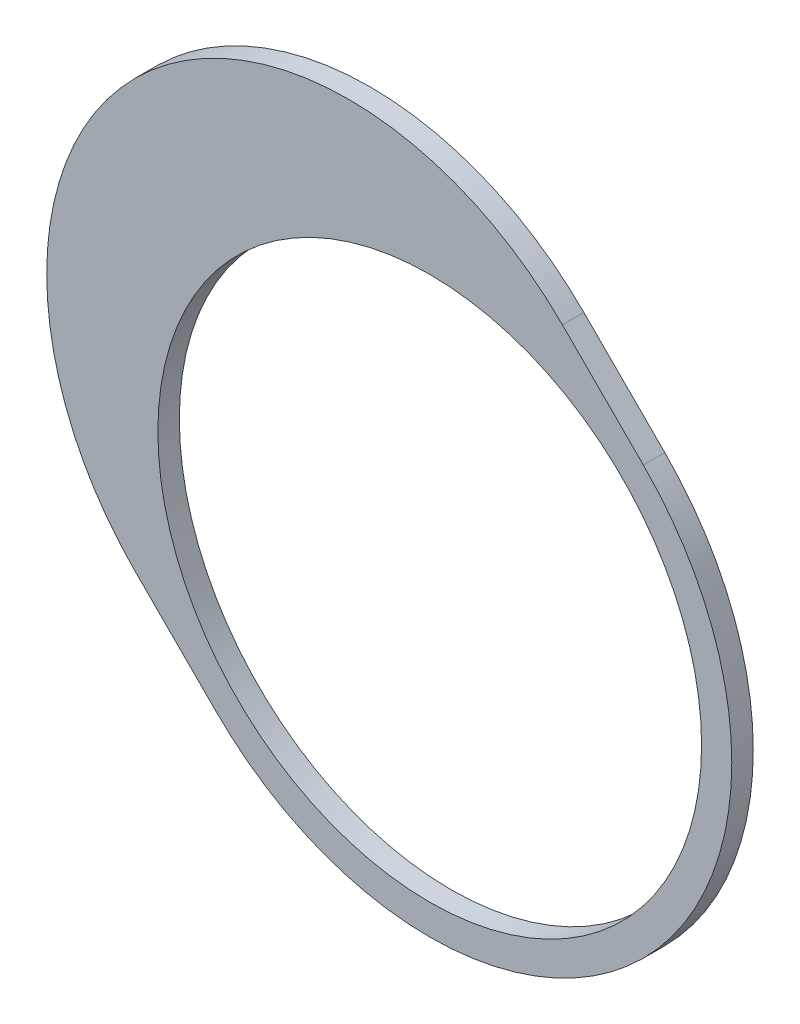
ISO-10303-21;
HEADER;
FILE_DESCRIPTION(('STEP AP214'),'2;1');
FILE_NAME('part.step','',(''),(''),'','','');
FILE_SCHEMA(('AUTOMOTIVE_DESIGN { 1 0 10303 214 1 1 1 1 }'));
ENDSEC;
DATA;
#1=APPLICATION_CONTEXT('core data for automotive mechanical design processes');
#2=APPLICATION_PROTOCOL_DEFINITION('international standard','automotive_design',2000,#1);
#3=PRODUCT_CONTEXT('',#1,'mechanical');
#4=PRODUCT('Part','Part','',(#3));
#5=PRODUCT_RELATED_PRODUCT_CATEGORY('part','',(#4));
#6=PRODUCT_DEFINITION_FORMATION('','',#4);
#7=PRODUCT_DEFINITION_CONTEXT('part definition',#1,'design');
#8=PRODUCT_DEFINITION('design','',#6,#7);
#9=PRODUCT_DEFINITION_SHAPE('','',#8);
#10=(LENGTH_UNIT() NAMED_UNIT(*) SI_UNIT(.MILLI.,.METRE.));
#11=(NAMED_UNIT(*) PLANE_ANGLE_UNIT() SI_UNIT($,.RADIAN.));
#12=(NAMED_UNIT(*) SI_UNIT($,.STERADIAN.) SOLID_ANGLE_UNIT());
#13=UNCERTAINTY_MEASURE_WITH_UNIT(LENGTH_MEASURE(1.E-05),#10,'distance_accuracy_value','');
#14=(GEOMETRIC_REPRESENTATION_CONTEXT(3) GLOBAL_UNCERTAINTY_ASSIGNED_CONTEXT((#13)) GLOBAL_UNIT_ASSIGNED_CONTEXT((#10,
#11,#12)) REPRESENTATION_CONTEXT('',''));
#15=CARTESIAN_POINT('',(0.,0.,0.));
#16=DIRECTION('',(0.,0.,1.));
#17=DIRECTION('',(1.,0.,0.));
#18=AXIS2_PLACEMENT_3D('',#15,#16,#17);
#19=CARTESIAN_POINT('',(45.51252264,68.18039958,0.));
#20=DIRECTION('',(0.70710678118651,0.707106781186585,0.));
#21=DIRECTION('',(0.707106781186585,-0.70710678118651,0.));
#22=AXIS2_PLACEMENT_3D('',#19,#20,#21);
#23=PLANE('',#22);
#24=DIRECTION('',(0.707106781186585,-0.70710678118651,0.));
#25=VECTOR('',#24,1.);
#26=CARTESIAN_POINT('',(45.51252264,68.18039958,0.03556));
#27=LINE('',#26,#25);
#28=CARTESIAN_POINT('',(45.51252264,68.18039958,0.03556));
#29=VERTEX_POINT('',#28);
#30=CARTESIAN_POINT('',(45.64645684,68.04646538,0.03556));
#31=VERTEX_POINT('',#30);
#32=EDGE_CURVE('E11',#29,#31,#27,.T.);
#33=ORIENTED_EDGE('',*,*,#32,.F.);
#34=DIRECTION('',(0.,0.,1.));
#35=VECTOR('',#34,1.);
#36=CARTESIAN_POINT('',(45.51252264,68.18039958,0.));
#37=LINE('',#36,#35);
#38=CARTESIAN_POINT('',(45.51252264,68.18039958,0.));
#39=VERTEX_POINT('',#38);
#40=EDGE_CURVE('E24',#39,#29,#37,.T.);
#41=ORIENTED_EDGE('',*,*,#40,.F.);
#42=DIRECTION('',(0.707106781186585,-0.70710678118651,0.));
#43=VECTOR('',#42,1.);
#44=CARTESIAN_POINT('',(45.51252264,68.18039958,0.));
#45=LINE('',#44,#43);
#46=CARTESIAN_POINT('',(45.64645684,68.04646538,0.));
#47=VERTEX_POINT('',#46);
#48=EDGE_CURVE('E96',#39,#47,#45,.T.);
#49=ORIENTED_EDGE('',*,*,#48,.T.);
#50=DIRECTION('',(0.,0.,1.));
#51=VECTOR('',#50,1.);
#52=CARTESIAN_POINT('',(45.64645684,68.04646538,0.));
#53=LINE('',#52,#51);
#54=EDGE_CURVE('E37',#47,#31,#53,.T.);
#55=ORIENTED_EDGE('',*,*,#54,.T.);
#56=EDGE_LOOP('',(#33,#41,#49,#55));
#57=FACE_BOUND('',#56,.T.);
#58=ADVANCED_FACE('F17',(#57),#23,.F.);
#59=CARTESIAN_POINT('',(45.86607413,68.53395234,0.));
#60=DIRECTION('',(0.,0.,-1.));
#61=DIRECTION('',(0.707105511180848,0.707108051189966,0.));
#62=AXIS2_PLACEMENT_3D('',#59,#60,#61);
#63=CYLINDRICAL_SURFACE('',#62,0.499998210181641);
#64=CARTESIAN_POINT('',(45.86607413,68.53395234,0.03556));
#65=DIRECTION('',(0.,0.,1.));
#66=DIRECTION('',(0.707105511180848,0.707108051189966,0.));
#67=AXIS2_PLACEMENT_3D('',#64,#65,#66);
#68=CIRCLE('',#67,0.499998210181641);
#69=CARTESIAN_POINT('',(46.21962562,68.8875051,0.03556));
#70=VERTEX_POINT('',#69);
#71=EDGE_CURVE('E92',#70,#29,#68,.T.);
#72=ORIENTED_EDGE('',*,*,#71,.F.);
#73=DIRECTION('',(0.,0.,1.));
#74=VECTOR('',#73,1.);
#75=CARTESIAN_POINT('',(46.21962562,68.8875051,0.));
#76=LINE('',#75,#74);
#77=CARTESIAN_POINT('',(46.21962562,68.8875051,0.));
#78=VERTEX_POINT('',#77);
#79=EDGE_CURVE('E90',#78,#70,#76,.T.);
#80=ORIENTED_EDGE('',*,*,#79,.F.);
#81=CARTESIAN_POINT('',(45.86607413,68.53395234,0.));
#82=DIRECTION('',(0.,0.,1.));
#83=DIRECTION('',(0.707105511180848,0.707108051189966,0.));
#84=AXIS2_PLACEMENT_3D('',#81,#82,#83);
#85=CIRCLE('',#84,0.499998210181641);
#86=EDGE_CURVE('E88',#78,#39,#85,.T.);
#87=ORIENTED_EDGE('',*,*,#86,.T.);
#88=ORIENTED_EDGE('',*,*,#40,.T.);
#89=EDGE_LOOP('',(#72,#80,#87,#88));
#90=FACE_BOUND('',#89,.T.);
#91=ADVANCED_FACE('F111',(#90),#63,.T.);
#92=CARTESIAN_POINT('',(46.0000096,68.40001687,0.));
#93=DIRECTION('',(0.,0.,-1.));
#94=DIRECTION('',(-0.707108051189952,-0.707105511180862,0.));
#95=AXIS2_PLACEMENT_3D('',#92,#93,#94);
#96=CYLINDRICAL_SURFACE('',#95,0.499998210181635);
#97=CARTESIAN_POINT('',(46.0000096,68.40001687,0.03556));
#98=DIRECTION('',(0.,0.,1.));
#99=DIRECTION('',(-0.707108051189952,-0.707105511180862,0.));
#100=AXIS2_PLACEMENT_3D('',#97,#98,#99);
#101=CIRCLE('',#100,0.499998210181635);
#102=CARTESIAN_POINT('',(46.35356236,68.75356836,0.03556));
#103=VERTEX_POINT('',#102);
#104=EDGE_CURVE('E85',#31,#103,#101,.T.);
#105=ORIENTED_EDGE('',*,*,#104,.F.);
#106=ORIENTED_EDGE('',*,*,#54,.F.);
#107=CARTESIAN_POINT('',(46.0000096,68.40001687,0.));
#108=DIRECTION('',(0.,0.,1.));
#109=DIRECTION('',(-0.707108051189952,-0.707105511180862,0.));
#110=AXIS2_PLACEMENT_3D('',#107,#108,#109);
#111=CIRCLE('',#110,0.499998210181635);
#112=CARTESIAN_POINT('',(46.35356236,68.75356836,0.));
#113=VERTEX_POINT('',#112);
#114=EDGE_CURVE('E82',#47,#113,#111,.T.);
#115=ORIENTED_EDGE('',*,*,#114,.T.);
#116=DIRECTION('',(0.,0.,1.));
#117=VECTOR('',#116,1.);
#118=CARTESIAN_POINT('',(46.35356236,68.75356836,0.));
#119=LINE('',#118,#117);
#120=EDGE_CURVE('E80',#113,#103,#119,.T.);
#121=ORIENTED_EDGE('',*,*,#120,.T.);
#122=EDGE_LOOP('',(#105,#106,#115,#121));
#123=FACE_BOUND('',#122,.T.);
#124=ADVANCED_FACE('F104',(#123),#96,.T.);
#125=CARTESIAN_POINT('',(46.35356236,68.75356836,0.));
#126=DIRECTION('',(-0.707106781186548,-0.707106781186548,0.));
#127=DIRECTION('',(-0.707106781186548,0.707106781186548,0.));
#128=AXIS2_PLACEMENT_3D('',#125,#126,#127);
#129=PLANE('',#128);
#130=DIRECTION('',(-0.707106781186548,0.707106781186548,0.));
#131=VECTOR('',#130,1.);
#132=CARTESIAN_POINT('',(46.35356236,68.75356836,0.03556));
#133=LINE('',#132,#131);
#134=EDGE_CURVE('E77',#103,#70,#133,.T.);
#135=ORIENTED_EDGE('',*,*,#134,.F.);
#136=ORIENTED_EDGE('',*,*,#120,.F.);
#137=DIRECTION('',(-0.707106781186548,0.707106781186548,0.));
#138=VECTOR('',#137,1.);
#139=CARTESIAN_POINT('',(46.35356236,68.75356836,0.));
#140=LINE('',#139,#138);
#141=EDGE_CURVE('E68',#113,#78,#140,.T.);
#142=ORIENTED_EDGE('',*,*,#141,.T.);
#143=ORIENTED_EDGE('',*,*,#79,.T.);
#144=EDGE_LOOP('',(#135,#136,#142,#143));
#145=FACE_BOUND('',#144,.T.);
#146=ADVANCED_FACE('F110',(#145),#129,.F.);
#147=CARTESIAN_POINT('',(46.0000096,68.4000156,0.));
#148=DIRECTION('',(0.,0.,-1.));
#149=DIRECTION('',(1.,0.,0.));
#150=AXIS2_PLACEMENT_3D('',#147,#148,#149);
#151=CYLINDRICAL_SURFACE('',#150,0.4499991);
#152=DIRECTION('',(0.,0.,1.));
#153=VECTOR('',#152,1.);
#154=CARTESIAN_POINT('',(46.4500087,68.4000156,0.));
#155=LINE('',#154,#153);
#156=CARTESIAN_POINT('',(46.4500087,68.4000156,0.));
#157=VERTEX_POINT('',#156);
#158=CARTESIAN_POINT('',(46.4500087,68.4000156,0.03556));
#159=VERTEX_POINT('',#158);
#160=EDGE_CURVE('E62',#157,#159,#155,.T.);
#161=ORIENTED_EDGE('',*,*,#160,.T.);
#162=CARTESIAN_POINT('',(46.0000096,68.4000156,0.03556));
#163=DIRECTION('',(0.,0.,1.));
#164=DIRECTION('',(1.,0.,0.));
#165=AXIS2_PLACEMENT_3D('',#162,#163,#164);
#166=CIRCLE('',#165,0.4499991);
#167=EDGE_CURVE('E67',#159,#159,#166,.T.);
#168=ORIENTED_EDGE('',*,*,#167,.T.);
#169=ORIENTED_EDGE('',*,*,#160,.F.);
#170=CARTESIAN_POINT('',(46.0000096,68.4000156,0.));
#171=DIRECTION('',(0.,0.,1.));
#172=DIRECTION('',(1.,0.,0.));
#173=AXIS2_PLACEMENT_3D('',#170,#171,#172);
#174=CIRCLE('',#173,0.4499991);
#175=EDGE_CURVE('E65',#157,#157,#174,.T.);
#176=ORIENTED_EDGE('',*,*,#175,.F.);
#177=EDGE_LOOP('',(#161,#168,#169,#176));
#178=FACE_BOUND('',#177,.T.);
#179=ADVANCED_FACE('F64',(#178),#151,.F.);
#180=CARTESIAN_POINT('',(45.51252264,68.18039958,0.));
#181=DIRECTION('',(0.,0.,-1.));
#182=DIRECTION('',(-1.,0.,0.));
#183=AXIS2_PLACEMENT_3D('',#180,#181,#182);
#184=PLANE('',#183);
#185=ORIENTED_EDGE('',*,*,#48,.F.);
#186=ORIENTED_EDGE('',*,*,#86,.F.);
#187=ORIENTED_EDGE('',*,*,#141,.F.);
#188=ORIENTED_EDGE('',*,*,#114,.F.);
#189=EDGE_LOOP('',(#185,#186,#187,#188));
#190=FACE_BOUND('',#189,.T.);
#191=ORIENTED_EDGE('',*,*,#175,.T.);
#192=EDGE_LOOP('',(#191));
#193=FACE_BOUND('',#192,.T.);
#194=ADVANCED_FACE('F71',(#190,#193),#184,.T.);
#195=CARTESIAN_POINT('',(45.51252264,68.18039958,0.03556));
#196=DIRECTION('',(0.,0.,-1.));
#197=DIRECTION('',(-1.,0.,0.));
#198=AXIS2_PLACEMENT_3D('',#195,#196,#197);
#199=PLANE('',#198);
#200=ORIENTED_EDGE('',*,*,#134,.T.);
#201=ORIENTED_EDGE('',*,*,#71,.T.);
#202=ORIENTED_EDGE('',*,*,#32,.T.);
#203=ORIENTED_EDGE('',*,*,#104,.T.);
#204=EDGE_LOOP('',(#200,#201,#202,#203));
#205=FACE_BOUND('',#204,.T.);
#206=ORIENTED_EDGE('',*,*,#167,.F.);
#207=EDGE_LOOP('',(#206));
#208=FACE_BOUND('',#207,.T.);
#209=ADVANCED_FACE('F107',(#205,#208),#199,.F.);
#210=CLOSED_SHELL('',(#58,#91,#124,#146,#179,#194,#209));
#211=MANIFOLD_SOLID_BREP('B1',#210);
#212=ADVANCED_BREP_SHAPE_REPRESENTATION('',(#18,#211),#14);
#213=SHAPE_DEFINITION_REPRESENTATION(#9,#212);
ENDSEC;
END-ISO-10303-21;
